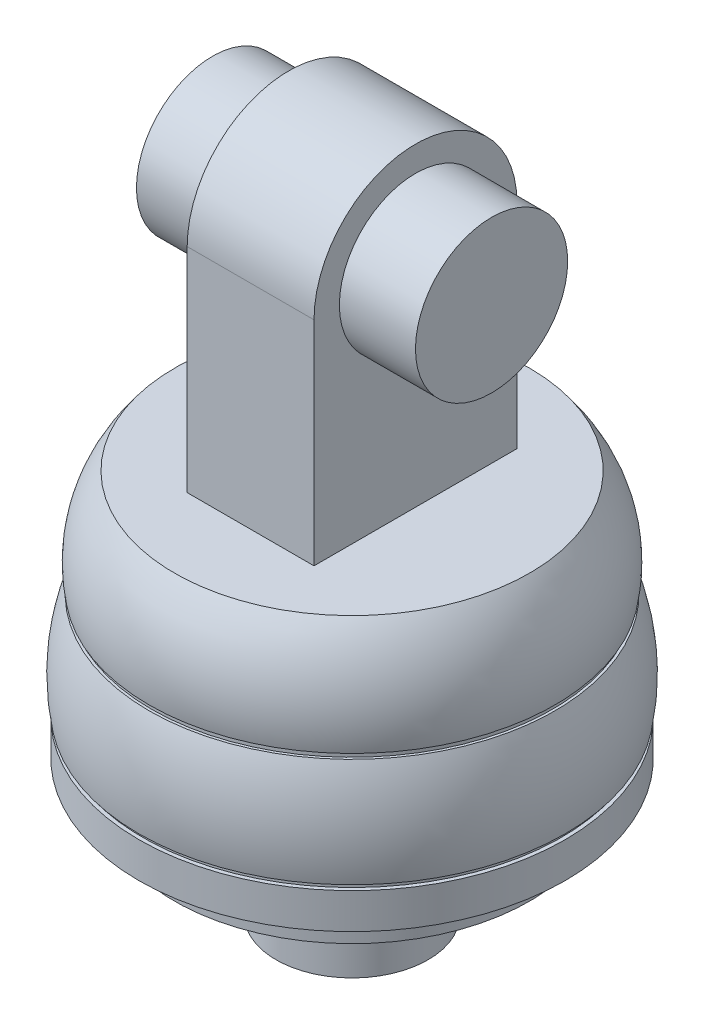
ISO-10303-21;
HEADER;
FILE_DESCRIPTION(('STEP AP214'),'2;1');
FILE_NAME('part.step','',(''),(''),'','','');
FILE_SCHEMA(('AUTOMOTIVE_DESIGN { 1 0 10303 214 1 1 1 1 }'));
ENDSEC;
DATA;
#1=APPLICATION_CONTEXT('core data for automotive mechanical design processes');
#2=APPLICATION_PROTOCOL_DEFINITION('international standard','automotive_design',2000,#1);
#3=PRODUCT_CONTEXT('',#1,'mechanical');
#4=PRODUCT('Part','Part','',(#3));
#5=PRODUCT_RELATED_PRODUCT_CATEGORY('part','',(#4));
#6=PRODUCT_DEFINITION_FORMATION('','',#4);
#7=PRODUCT_DEFINITION_CONTEXT('part definition',#1,'design');
#8=PRODUCT_DEFINITION('design','',#6,#7);
#9=PRODUCT_DEFINITION_SHAPE('','',#8);
#10=(LENGTH_UNIT() NAMED_UNIT(*) SI_UNIT(.MILLI.,.METRE.));
#11=(NAMED_UNIT(*) PLANE_ANGLE_UNIT() SI_UNIT($,.RADIAN.));
#12=(NAMED_UNIT(*) SI_UNIT($,.STERADIAN.) SOLID_ANGLE_UNIT());
#13=UNCERTAINTY_MEASURE_WITH_UNIT(LENGTH_MEASURE(1.E-05),#10,'distance_accuracy_value','');
#14=(GEOMETRIC_REPRESENTATION_CONTEXT(3) GLOBAL_UNCERTAINTY_ASSIGNED_CONTEXT((#13)) GLOBAL_UNIT_ASSIGNED_CONTEXT((#10,
#11,#12)) REPRESENTATION_CONTEXT('',''));
#15=CARTESIAN_POINT('',(0.,0.,0.));
#16=DIRECTION('',(0.,0.,1.));
#17=DIRECTION('',(1.,0.,0.));
#18=AXIS2_PLACEMENT_3D('',#15,#16,#17);
#19=CARTESIAN_POINT('',(-27.5,62.,0.));
#20=DIRECTION('',(1.,0.,0.));
#21=DIRECTION('',(0.,0.,-1.));
#22=AXIS2_PLACEMENT_3D('',#19,#20,#21);
#23=CYLINDRICAL_SURFACE('',#22,15.);
#24=CARTESIAN_POINT('',(-27.5,62.,0.));
#25=DIRECTION('',(-1.,0.,0.));
#26=DIRECTION('',(0.,0.,1.));
#27=AXIS2_PLACEMENT_3D('',#24,#25,#26);
#28=CIRCLE('',#27,15.);
#29=CARTESIAN_POINT('',(-27.5,62.,15.));
#30=VERTEX_POINT('',#29);
#31=EDGE_CURVE('E11',#30,#30,#28,.T.);
#32=ORIENTED_EDGE('',*,*,#31,.F.);
#33=EDGE_LOOP('',(#32));
#34=FACE_BOUND('',#33,.T.);
#35=CARTESIAN_POINT('',(-12.5,62.,0.));
#36=DIRECTION('',(-1.,0.,0.));
#37=DIRECTION('',(0.,0.,1.));
#38=AXIS2_PLACEMENT_3D('',#35,#36,#37);
#39=CIRCLE('',#38,15.);
#40=CARTESIAN_POINT('',(-12.5,62.,15.));
#41=VERTEX_POINT('',#40);
#42=EDGE_CURVE('E54',#41,#41,#39,.T.);
#43=ORIENTED_EDGE('',*,*,#42,.T.);
#44=EDGE_LOOP('',(#43));
#45=FACE_BOUND('',#44,.T.);
#46=ADVANCED_FACE('F51',(#34,#45),#23,.T.);
#47=CARTESIAN_POINT('',(-27.5,62.,0.));
#48=DIRECTION('',(-1.,0.,0.));
#49=DIRECTION('',(0.,0.,1.));
#50=AXIS2_PLACEMENT_3D('',#47,#48,#49);
#51=PLANE('',#50);
#52=ORIENTED_EDGE('',*,*,#31,.T.);
#53=EDGE_LOOP('',(#52));
#54=FACE_BOUND('',#53,.T.);
#55=ADVANCED_FACE('F66',(#54),#51,.T.);
#56=CARTESIAN_POINT('',(-12.5,62.,0.));
#57=DIRECTION('',(-1.,0.,0.));
#58=DIRECTION('',(0.,0.,1.));
#59=AXIS2_PLACEMENT_3D('',#56,#57,#58);
#60=PLANE('',#59);
#61=ORIENTED_EDGE('',*,*,#42,.F.);
#62=EDGE_LOOP('',(#61));
#63=FACE_BOUND('',#62,.T.);
#64=ADVANCED_FACE('F64',(#63),#60,.F.);
#65=CLOSED_SHELL('',(#46,#55,#64));
#66=MANIFOLD_SOLID_BREP('B2',#65);
#67=CARTESIAN_POINT('',(0.,20.,0.));
#68=DIRECTION('',(0.,-1.,0.));
#69=DIRECTION('',(0.,0.,-1.));
#70=AXIS2_PLACEMENT_3D('',#67,#68,#69);
#71=PLANE('',#70);
#72=CARTESIAN_POINT('',(0.,20.,0.));
#73=DIRECTION('',(0.,-1.,0.));
#74=DIRECTION('',(0.,0.,-1.));
#75=AXIS2_PLACEMENT_3D('',#72,#73,#74);
#76=CIRCLE('',#75,35.);
#77=CARTESIAN_POINT('',(0.,20.,-35.));
#78=VERTEX_POINT('',#77);
#79=EDGE_CURVE('E240',#78,#78,#76,.T.);
#80=ORIENTED_EDGE('',*,*,#79,.F.);
#81=EDGE_LOOP('',(#80));
#82=FACE_BOUND('',#81,.T.);
#83=DIRECTION('',(0.,0.,-1.));
#84=VECTOR('',#83,1.);
#85=CARTESIAN_POINT('',(12.5,20.,20.));
#86=LINE('',#85,#84);
#87=CARTESIAN_POINT('',(12.5,20.,20.));
#88=VERTEX_POINT('',#87);
#89=CARTESIAN_POINT('',(12.5,20.,-20.));
#90=VERTEX_POINT('',#89);
#91=EDGE_CURVE('E114',#88,#90,#86,.T.);
#92=ORIENTED_EDGE('',*,*,#91,.F.);
#93=DIRECTION('',(1.,0.,0.));
#94=VECTOR('',#93,1.);
#95=CARTESIAN_POINT('',(-12.5,20.,20.));
#96=LINE('',#95,#94);
#97=CARTESIAN_POINT('',(-12.5,20.,20.));
#98=VERTEX_POINT('',#97);
#99=EDGE_CURVE('E118',#98,#88,#96,.T.);
#100=ORIENTED_EDGE('',*,*,#99,.F.);
#101=DIRECTION('',(0.,0.,1.));
#102=VECTOR('',#101,1.);
#103=CARTESIAN_POINT('',(-12.5,20.,20.));
#104=LINE('',#103,#102);
#105=CARTESIAN_POINT('',(-12.5,20.,-20.));
#106=VERTEX_POINT('',#105);
#107=EDGE_CURVE('E156',#106,#98,#104,.T.);
#108=ORIENTED_EDGE('',*,*,#107,.F.);
#109=DIRECTION('',(-1.,0.,0.));
#110=VECTOR('',#109,1.);
#111=CARTESIAN_POINT('',(-12.5,20.,-20.));
#112=LINE('',#111,#110);
#113=EDGE_CURVE('E176',#90,#106,#112,.T.);
#114=ORIENTED_EDGE('',*,*,#113,.F.);
#115=EDGE_LOOP('',(#92,#100,#108,#114));
#116=FACE_BOUND('',#115,.T.);
#117=ADVANCED_FACE('F98',(#82,#116),#71,.F.);
#118=CARTESIAN_POINT('',(0.,0.,0.));
#119=DIRECTION('',(0.,1.,0.));
#120=DIRECTION('',(0.,0.,1.));
#121=AXIS2_PLACEMENT_3D('',#118,#119,#120);
#122=PLANE('',#121);
#123=CARTESIAN_POINT('',(0.,0.,0.));
#124=DIRECTION('',(0.,-1.,0.));
#125=DIRECTION('',(0.,0.,-1.));
#126=AXIS2_PLACEMENT_3D('',#123,#124,#125);
#127=CIRCLE('',#126,39.5);
#128=CARTESIAN_POINT('',(0.,0.,-39.5));
#129=VERTEX_POINT('',#128);
#130=EDGE_CURVE('E224',#129,#129,#127,.T.);
#131=ORIENTED_EDGE('',*,*,#130,.F.);
#132=EDGE_LOOP('',(#131));
#133=FACE_BOUND('',#132,.T.);
#134=CARTESIAN_POINT('',(0.,0.,0.));
#135=DIRECTION('',(0.,-1.,0.));
#136=DIRECTION('',(0.,0.,-1.));
#137=AXIS2_PLACEMENT_3D('',#134,#135,#136);
#138=CIRCLE('',#137,40.);
#139=CARTESIAN_POINT('',(0.,0.,-40.));
#140=VERTEX_POINT('',#139);
#141=EDGE_CURVE('E236',#140,#140,#138,.T.);
#142=ORIENTED_EDGE('',*,*,#141,.T.);
#143=EDGE_LOOP('',(#142));
#144=FACE_BOUND('',#143,.T.);
#145=ADVANCED_FACE('F100',(#133,#144),#122,.F.);
#146=CARTESIAN_POINT('',(0.,4.47598824382561,0.));
#147=DIRECTION('',(0.,-1.,0.));
#148=DIRECTION('',(0.,0.,-1.));
#149=AXIS2_PLACEMENT_3D('',#146,#147,#148);
#150=DEGENERATE_TOROIDAL_SURFACE('',#149,15.4039529753024,25.,.T.);
#151=ORIENTED_EDGE('',*,*,#141,.F.);
#152=EDGE_LOOP('',(#151));
#153=FACE_BOUND('',#152,.T.);
#154=ORIENTED_EDGE('',*,*,#79,.T.);
#155=EDGE_LOOP('',(#154));
#156=FACE_BOUND('',#155,.T.);
#157=ADVANCED_FACE('F247',(#153,#156),#150,.T.);
#158=CARTESIAN_POINT('',(0.,-1.,0.));
#159=DIRECTION('',(0.,1.,0.));
#160=DIRECTION('',(0.,0.,1.));
#161=AXIS2_PLACEMENT_3D('',#158,#159,#160);
#162=CYLINDRICAL_SURFACE('',#161,39.5);
#163=CARTESIAN_POINT('',(0.,-1.,0.));
#164=DIRECTION('',(0.,-1.,0.));
#165=DIRECTION('',(0.,0.,-1.));
#166=AXIS2_PLACEMENT_3D('',#163,#164,#165);
#167=CIRCLE('',#166,39.5);
#168=CARTESIAN_POINT('',(0.,-1.,-39.5));
#169=VERTEX_POINT('',#168);
#170=EDGE_CURVE('E232',#169,#169,#167,.T.);
#171=ORIENTED_EDGE('',*,*,#170,.F.);
#172=EDGE_LOOP('',(#171));
#173=FACE_BOUND('',#172,.T.);
#174=ORIENTED_EDGE('',*,*,#130,.T.);
#175=EDGE_LOOP('',(#174));
#176=FACE_BOUND('',#175,.T.);
#177=ADVANCED_FACE('F257',(#173,#176),#162,.T.);
#178=CARTESIAN_POINT('',(0.,-14.543226699711,0.));
#179=DIRECTION('',(0.,1.,0.));
#180=DIRECTION('',(0.,0.,1.));
#181=AXIS2_PLACEMENT_3D('',#178,#179,#180);
#182=DEGENERATE_TOROIDAL_SURFACE('',#181,5.56773300289049,37.,.T.);
#183=CARTESIAN_POINT('',(0.,-21.,0.));
#184=DIRECTION('',(0.,1.,0.));
#185=DIRECTION('',(0.,0.,1.));
#186=AXIS2_PLACEMENT_3D('',#183,#184,#185);
#187=CIRCLE('',#186,42.);
#188=CARTESIAN_POINT('',(0.,-21.,42.));
#189=VERTEX_POINT('',#188);
#190=EDGE_CURVE('E228',#189,#189,#187,.T.);
#191=ORIENTED_EDGE('',*,*,#190,.T.);
#192=EDGE_LOOP('',(#191));
#193=FACE_BOUND('',#192,.T.);
#194=CARTESIAN_POINT('',(0.,-0.999999999999995,0.));
#195=DIRECTION('',(0.,1.,0.));
#196=DIRECTION('',(0.,0.,1.));
#197=AXIS2_PLACEMENT_3D('',#194,#195,#196);
#198=CIRCLE('',#197,40.);
#199=CARTESIAN_POINT('',(0.,-1.,40.));
#200=VERTEX_POINT('',#199);
#201=EDGE_CURVE('E220',#200,#200,#198,.T.);
#202=ORIENTED_EDGE('',*,*,#201,.F.);
#203=EDGE_LOOP('',(#202));
#204=FACE_BOUND('',#203,.T.);
#205=ADVANCED_FACE('F261',(#193,#204),#182,.T.);
#206=CARTESIAN_POINT('',(0.,-21.,0.));
#207=DIRECTION('',(0.,-1.,0.));
#208=DIRECTION('',(0.,0.,-1.));
#209=AXIS2_PLACEMENT_3D('',#206,#207,#208);
#210=PLANE('',#209);
#211=CARTESIAN_POINT('',(0.,-21.,0.));
#212=DIRECTION('',(0.,-1.,0.));
#213=DIRECTION('',(0.,0.,-1.));
#214=AXIS2_PLACEMENT_3D('',#211,#212,#213);
#215=CIRCLE('',#214,41.25);
#216=CARTESIAN_POINT('',(0.,-21.,-41.25));
#217=VERTEX_POINT('',#216);
#218=EDGE_CURVE('E208',#217,#217,#215,.T.);
#219=ORIENTED_EDGE('',*,*,#218,.F.);
#220=EDGE_LOOP('',(#219));
#221=FACE_BOUND('',#220,.T.);
#222=ORIENTED_EDGE('',*,*,#190,.F.);
#223=EDGE_LOOP('',(#222));
#224=FACE_BOUND('',#223,.T.);
#225=ADVANCED_FACE('F265',(#221,#224),#210,.T.);
#226=CARTESIAN_POINT('',(0.,-1.,40.));
#227=DIRECTION('',(0.,1.,0.));
#228=DIRECTION('',(0.,0.,1.));
#229=AXIS2_PLACEMENT_3D('',#226,#227,#228);
#230=PLANE('',#229);
#231=ORIENTED_EDGE('',*,*,#170,.T.);
#232=EDGE_LOOP('',(#231));
#233=FACE_BOUND('',#232,.T.);
#234=ORIENTED_EDGE('',*,*,#201,.T.);
#235=EDGE_LOOP('',(#234));
#236=FACE_BOUND('',#235,.T.);
#237=ADVANCED_FACE('F269',(#233,#236),#230,.T.);
#238=CARTESIAN_POINT('',(0.,-22.,0.));
#239=DIRECTION('',(0.,1.,0.));
#240=DIRECTION('',(0.,0.,1.));
#241=AXIS2_PLACEMENT_3D('',#238,#239,#240);
#242=CYLINDRICAL_SURFACE('',#241,41.25);
#243=CARTESIAN_POINT('',(0.,-22.,0.));
#244=DIRECTION('',(0.,-1.,0.));
#245=DIRECTION('',(0.,0.,-1.));
#246=AXIS2_PLACEMENT_3D('',#243,#244,#245);
#247=CIRCLE('',#246,41.25);
#248=CARTESIAN_POINT('',(0.,-22.,-41.25));
#249=VERTEX_POINT('',#248);
#250=EDGE_CURVE('E213',#249,#249,#247,.T.);
#251=ORIENTED_EDGE('',*,*,#250,.F.);
#252=EDGE_LOOP('',(#251));
#253=FACE_BOUND('',#252,.T.);
#254=ORIENTED_EDGE('',*,*,#218,.T.);
#255=EDGE_LOOP('',(#254));
#256=FACE_BOUND('',#255,.T.);
#257=ADVANCED_FACE('F273',(#253,#256),#242,.T.);
#258=CARTESIAN_POINT('',(0.,-29.,0.));
#259=DIRECTION('',(0.,1.,0.));
#260=DIRECTION('',(0.,0.,1.));
#261=AXIS2_PLACEMENT_3D('',#258,#259,#260);
#262=CYLINDRICAL_SURFACE('',#261,42.);
#263=CARTESIAN_POINT('',(0.,-29.,0.));
#264=DIRECTION('',(0.,-1.,0.));
#265=DIRECTION('',(0.,0.,-1.));
#266=AXIS2_PLACEMENT_3D('',#263,#264,#265);
#267=CIRCLE('',#266,42.);
#268=CARTESIAN_POINT('',(0.,-29.,-42.));
#269=VERTEX_POINT('',#268);
#270=EDGE_CURVE('E209',#269,#269,#267,.T.);
#271=ORIENTED_EDGE('',*,*,#270,.F.);
#272=EDGE_LOOP('',(#271));
#273=FACE_BOUND('',#272,.T.);
#274=CARTESIAN_POINT('',(0.,-22.,0.));
#275=DIRECTION('',(0.,-1.,0.));
#276=DIRECTION('',(0.,0.,-1.));
#277=AXIS2_PLACEMENT_3D('',#274,#275,#276);
#278=CIRCLE('',#277,42.);
#279=CARTESIAN_POINT('',(0.,-22.,-42.));
#280=VERTEX_POINT('',#279);
#281=EDGE_CURVE('E204',#280,#280,#278,.T.);
#282=ORIENTED_EDGE('',*,*,#281,.T.);
#283=EDGE_LOOP('',(#282));
#284=FACE_BOUND('',#283,.T.);
#285=ADVANCED_FACE('F277',(#273,#284),#262,.T.);
#286=CARTESIAN_POINT('',(0.,-29.,0.));
#287=DIRECTION('',(0.,-1.,0.));
#288=DIRECTION('',(0.,0.,-1.));
#289=AXIS2_PLACEMENT_3D('',#286,#287,#288);
#290=PLANE('',#289);
#291=CARTESIAN_POINT('',(0.,-29.,0.));
#292=DIRECTION('',(0.,-1.,0.));
#293=DIRECTION('',(0.,0.,-1.));
#294=AXIS2_PLACEMENT_3D('',#291,#292,#293);
#295=CIRCLE('',#294,35.);
#296=CARTESIAN_POINT('',(0.,-29.,-35.));
#297=VERTEX_POINT('',#296);
#298=EDGE_CURVE('E200',#297,#297,#295,.T.);
#299=ORIENTED_EDGE('',*,*,#298,.F.);
#300=EDGE_LOOP('',(#299));
#301=FACE_BOUND('',#300,.T.);
#302=ORIENTED_EDGE('',*,*,#270,.T.);
#303=EDGE_LOOP('',(#302));
#304=FACE_BOUND('',#303,.T.);
#305=ADVANCED_FACE('F281',(#301,#304),#290,.T.);
#306=CARTESIAN_POINT('',(0.,-22.,0.));
#307=DIRECTION('',(0.,-1.,0.));
#308=DIRECTION('',(0.,0.,-1.));
#309=AXIS2_PLACEMENT_3D('',#306,#307,#308);
#310=PLANE('',#309);
#311=ORIENTED_EDGE('',*,*,#250,.T.);
#312=EDGE_LOOP('',(#311));
#313=FACE_BOUND('',#312,.T.);
#314=ORIENTED_EDGE('',*,*,#281,.F.);
#315=EDGE_LOOP('',(#314));
#316=FACE_BOUND('',#315,.T.);
#317=ADVANCED_FACE('F283',(#313,#316),#310,.F.);
#318=CARTESIAN_POINT('',(0.,-36.,0.));
#319=DIRECTION('',(0.,1.,0.));
#320=DIRECTION('',(0.,0.,1.));
#321=AXIS2_PLACEMENT_3D('',#318,#319,#320);
#322=CYLINDRICAL_SURFACE('',#321,35.);
#323=CARTESIAN_POINT('',(0.,-36.,0.));
#324=DIRECTION('',(0.,-1.,0.));
#325=DIRECTION('',(0.,0.,-1.));
#326=AXIS2_PLACEMENT_3D('',#323,#324,#325);
#327=CIRCLE('',#326,35.);
#328=CARTESIAN_POINT('',(0.,-36.,-35.));
#329=VERTEX_POINT('',#328);
#330=EDGE_CURVE('E196',#329,#329,#327,.T.);
#331=ORIENTED_EDGE('',*,*,#330,.F.);
#332=EDGE_LOOP('',(#331));
#333=FACE_BOUND('',#332,.T.);
#334=ORIENTED_EDGE('',*,*,#298,.T.);
#335=EDGE_LOOP('',(#334));
#336=FACE_BOUND('',#335,.T.);
#337=ADVANCED_FACE('F286',(#333,#336),#322,.T.);
#338=CARTESIAN_POINT('',(0.,-36.,0.));
#339=DIRECTION('',(0.,-1.,0.));
#340=DIRECTION('',(0.,0.,-1.));
#341=AXIS2_PLACEMENT_3D('',#338,#339,#340);
#342=PLANE('',#341);
#343=CARTESIAN_POINT('',(0.,-36.,0.));
#344=DIRECTION('',(0.,-1.,0.));
#345=DIRECTION('',(0.,0.,-1.));
#346=AXIS2_PLACEMENT_3D('',#343,#344,#345);
#347=CIRCLE('',#346,15.);
#348=CARTESIAN_POINT('',(0.,-36.,-15.));
#349=VERTEX_POINT('',#348);
#350=EDGE_CURVE('E107',#349,#349,#347,.T.);
#351=ORIENTED_EDGE('',*,*,#350,.F.);
#352=EDGE_LOOP('',(#351));
#353=FACE_BOUND('',#352,.T.);
#354=ORIENTED_EDGE('',*,*,#330,.T.);
#355=EDGE_LOOP('',(#354));
#356=FACE_BOUND('',#355,.T.);
#357=ADVANCED_FACE('F293',(#353,#356),#342,.T.);
#358=CARTESIAN_POINT('',(0.,-56.,0.));
#359=DIRECTION('',(0.,1.,0.));
#360=DIRECTION('',(0.,0.,1.));
#361=AXIS2_PLACEMENT_3D('',#358,#359,#360);
#362=CYLINDRICAL_SURFACE('',#361,15.);
#363=CARTESIAN_POINT('',(0.,-56.,0.));
#364=DIRECTION('',(0.,-1.,0.));
#365=DIRECTION('',(0.,0.,-1.));
#366=AXIS2_PLACEMENT_3D('',#363,#364,#365);
#367=CIRCLE('',#366,15.);
#368=CARTESIAN_POINT('',(0.,-56.,-15.));
#369=VERTEX_POINT('',#368);
#370=EDGE_CURVE('E192',#369,#369,#367,.T.);
#371=ORIENTED_EDGE('',*,*,#370,.F.);
#372=EDGE_LOOP('',(#371));
#373=FACE_BOUND('',#372,.T.);
#374=ORIENTED_EDGE('',*,*,#350,.T.);
#375=EDGE_LOOP('',(#374));
#376=FACE_BOUND('',#375,.T.);
#377=ADVANCED_FACE('F297',(#373,#376),#362,.T.);
#378=CARTESIAN_POINT('',(0.,-56.,0.));
#379=DIRECTION('',(0.,-1.,0.));
#380=DIRECTION('',(0.,0.,-1.));
#381=AXIS2_PLACEMENT_3D('',#378,#379,#380);
#382=PLANE('',#381);
#383=ORIENTED_EDGE('',*,*,#370,.T.);
#384=EDGE_LOOP('',(#383));
#385=FACE_BOUND('',#384,.T.);
#386=ADVANCED_FACE('F301',(#385),#382,.T.);
#387=CARTESIAN_POINT('',(12.5,62.,20.));
#388=DIRECTION('',(-1.,0.,0.));
#389=DIRECTION('',(0.,0.,1.));
#390=AXIS2_PLACEMENT_3D('',#387,#388,#389);
#391=PLANE('',#390);
#392=CARTESIAN_POINT('',(12.5,62.,0.));
#393=DIRECTION('',(-1.,0.,0.));
#394=DIRECTION('',(0.,0.,1.));
#395=AXIS2_PLACEMENT_3D('',#392,#393,#394);
#396=CIRCLE('',#395,15.);
#397=CARTESIAN_POINT('',(12.5,62.,15.));
#398=VERTEX_POINT('',#397);
#399=EDGE_CURVE('E49',#398,#398,#396,.F.);
#400=ORIENTED_EDGE('',*,*,#399,.F.);
#401=EDGE_LOOP('',(#400));
#402=FACE_BOUND('',#401,.T.);
#403=ORIENTED_EDGE('',*,*,#91,.T.);
#404=DIRECTION('',(0.,-1.,0.));
#405=VECTOR('',#404,1.);
#406=CARTESIAN_POINT('',(12.5,62.,-20.));
#407=LINE('',#406,#405);
#408=CARTESIAN_POINT('',(12.5,62.,-20.));
#409=VERTEX_POINT('',#408);
#410=EDGE_CURVE('E188',#409,#90,#407,.T.);
#411=ORIENTED_EDGE('',*,*,#410,.F.);
#412=CARTESIAN_POINT('',(12.5,62.,0.));
#413=DIRECTION('',(1.,0.,0.));
#414=DIRECTION('',(0.,0.,-1.));
#415=AXIS2_PLACEMENT_3D('',#412,#413,#414);
#416=CIRCLE('',#415,20.);
#417=CARTESIAN_POINT('',(12.5,62.,20.));
#418=VERTEX_POINT('',#417);
#419=EDGE_CURVE('E163',#409,#418,#416,.T.);
#420=ORIENTED_EDGE('',*,*,#419,.T.);
#421=DIRECTION('',(0.,-1.,0.));
#422=VECTOR('',#421,1.);
#423=CARTESIAN_POINT('',(12.5,62.,20.));
#424=LINE('',#423,#422);
#425=EDGE_CURVE('E143',#418,#88,#424,.T.);
#426=ORIENTED_EDGE('',*,*,#425,.T.);
#427=EDGE_LOOP('',(#403,#411,#420,#426));
#428=FACE_BOUND('',#427,.T.);
#429=ADVANCED_FACE('F305',(#402,#428),#391,.F.);
#430=CARTESIAN_POINT('',(-12.5,62.,-20.));
#431=DIRECTION('',(0.,0.,1.));
#432=DIRECTION('',(1.,0.,0.));
#433=AXIS2_PLACEMENT_3D('',#430,#431,#432);
#434=PLANE('',#433);
#435=ORIENTED_EDGE('',*,*,#113,.T.);
#436=DIRECTION('',(0.,-1.,0.));
#437=VECTOR('',#436,1.);
#438=CARTESIAN_POINT('',(-12.5,62.,-20.));
#439=LINE('',#438,#437);
#440=CARTESIAN_POINT('',(-12.5,62.,-20.));
#441=VERTEX_POINT('',#440);
#442=EDGE_CURVE('E158',#441,#106,#439,.T.);
#443=ORIENTED_EDGE('',*,*,#442,.F.);
#444=DIRECTION('',(-1.,0.,0.));
#445=VECTOR('',#444,1.);
#446=CARTESIAN_POINT('',(-12.5,62.,-20.));
#447=LINE('',#446,#445);
#448=EDGE_CURVE('E149',#409,#441,#447,.T.);
#449=ORIENTED_EDGE('',*,*,#448,.F.);
#450=ORIENTED_EDGE('',*,*,#410,.T.);
#451=EDGE_LOOP('',(#435,#443,#449,#450));
#452=FACE_BOUND('',#451,.T.);
#453=ADVANCED_FACE('F309',(#452),#434,.F.);
#454=CARTESIAN_POINT('',(-12.5,62.,20.));
#455=DIRECTION('',(1.,0.,0.));
#456=DIRECTION('',(0.,0.,-1.));
#457=AXIS2_PLACEMENT_3D('',#454,#455,#456);
#458=PLANE('',#457);
#459=ORIENTED_EDGE('',*,*,#107,.T.);
#460=DIRECTION('',(0.,-1.,0.));
#461=VECTOR('',#460,1.);
#462=CARTESIAN_POINT('',(-12.5,62.,20.));
#463=LINE('',#462,#461);
#464=CARTESIAN_POINT('',(-12.5,62.,20.));
#465=VERTEX_POINT('',#464);
#466=EDGE_CURVE('E141',#465,#98,#463,.T.);
#467=ORIENTED_EDGE('',*,*,#466,.F.);
#468=CARTESIAN_POINT('',(-12.5,62.,0.));
#469=DIRECTION('',(1.,0.,0.));
#470=DIRECTION('',(0.,0.,-1.));
#471=AXIS2_PLACEMENT_3D('',#468,#469,#470);
#472=CIRCLE('',#471,20.);
#473=EDGE_CURVE('E155',#441,#465,#472,.T.);
#474=ORIENTED_EDGE('',*,*,#473,.F.);
#475=ORIENTED_EDGE('',*,*,#442,.T.);
#476=EDGE_LOOP('',(#459,#467,#474,#475));
#477=FACE_BOUND('',#476,.T.);
#478=ADVANCED_FACE('F153',(#477),#458,.F.);
#479=CARTESIAN_POINT('',(-12.5,62.,20.));
#480=DIRECTION('',(0.,0.,-1.));
#481=DIRECTION('',(-1.,0.,0.));
#482=AXIS2_PLACEMENT_3D('',#479,#480,#481);
#483=PLANE('',#482);
#484=ORIENTED_EDGE('',*,*,#99,.T.);
#485=ORIENTED_EDGE('',*,*,#425,.F.);
#486=DIRECTION('',(1.,0.,0.));
#487=VECTOR('',#486,1.);
#488=CARTESIAN_POINT('',(-12.5,62.,20.));
#489=LINE('',#488,#487);
#490=EDGE_CURVE('E138',#465,#418,#489,.T.);
#491=ORIENTED_EDGE('',*,*,#490,.F.);
#492=ORIENTED_EDGE('',*,*,#466,.T.);
#493=EDGE_LOOP('',(#484,#485,#491,#492));
#494=FACE_BOUND('',#493,.T.);
#495=ADVANCED_FACE('F140',(#494),#483,.F.);
#496=CARTESIAN_POINT('',(12.5,62.,0.));
#497=DIRECTION('',(-1.,0.,0.));
#498=DIRECTION('',(0.,0.,1.));
#499=AXIS2_PLACEMENT_3D('',#496,#497,#498);
#500=CYLINDRICAL_SURFACE('',#499,20.);
#501=ORIENTED_EDGE('',*,*,#473,.T.);
#502=ORIENTED_EDGE('',*,*,#490,.T.);
#503=ORIENTED_EDGE('',*,*,#419,.F.);
#504=ORIENTED_EDGE('',*,*,#448,.T.);
#505=EDGE_LOOP('',(#501,#502,#503,#504));
#506=FACE_BOUND('',#505,.T.);
#507=ADVANCED_FACE('F161',(#506),#500,.T.);
#508=CARTESIAN_POINT('',(27.5,62.,0.));
#509=DIRECTION('',(-1.,0.,0.));
#510=DIRECTION('',(0.,0.,1.));
#511=AXIS2_PLACEMENT_3D('',#508,#509,#510);
#512=CYLINDRICAL_SURFACE('',#511,15.);
#513=CARTESIAN_POINT('',(27.5,62.,0.));
#514=DIRECTION('',(1.,0.,0.));
#515=DIRECTION('',(0.,0.,-1.));
#516=AXIS2_PLACEMENT_3D('',#513,#514,#515);
#517=CIRCLE('',#516,15.);
#518=CARTESIAN_POINT('',(27.5,62.,-15.));
#519=VERTEX_POINT('',#518);
#520=EDGE_CURVE('E164',#519,#519,#517,.T.);
#521=ORIENTED_EDGE('',*,*,#520,.F.);
#522=EDGE_LOOP('',(#521));
#523=FACE_BOUND('',#522,.T.);
#524=ORIENTED_EDGE('',*,*,#399,.T.);
#525=EDGE_LOOP('',(#524));
#526=FACE_BOUND('',#525,.T.);
#527=ADVANCED_FACE('F320',(#523,#526),#512,.T.);
#528=CARTESIAN_POINT('',(27.5,62.,0.));
#529=DIRECTION('',(1.,0.,0.));
#530=DIRECTION('',(0.,0.,-1.));
#531=AXIS2_PLACEMENT_3D('',#528,#529,#530);
#532=PLANE('',#531);
#533=ORIENTED_EDGE('',*,*,#520,.T.);
#534=EDGE_LOOP('',(#533));
#535=FACE_BOUND('',#534,.T.);
#536=ADVANCED_FACE('F323',(#535),#532,.T.);
#537=CLOSED_SHELL('',(#117,#145,#157,#177,#205,#225,#237,#257,#285,#305,#317,#337,#357,#377,
#386,#429,#453,#478,#495,#507,#527,#536));
#538=MANIFOLD_SOLID_BREP('B6',#537);
#539=ADVANCED_BREP_SHAPE_REPRESENTATION('',(#18,#66,#538),#14);
#540=SHAPE_DEFINITION_REPRESENTATION(#9,#539);
ENDSEC;
END-ISO-10303-21;
